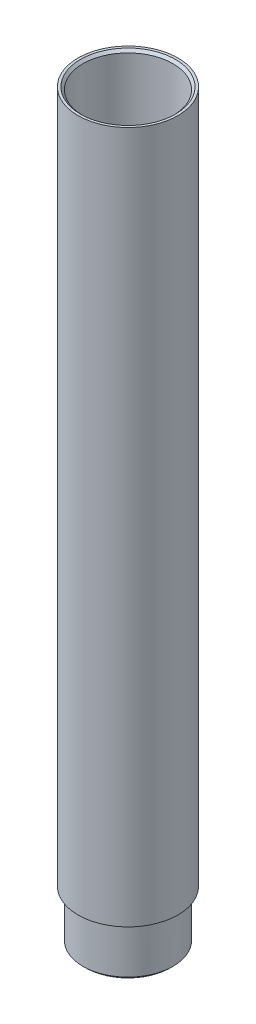
ISO-10303-21;
HEADER;
FILE_DESCRIPTION(('STEP AP214'),'2;1');
FILE_NAME('part.step','',(''),(''),'','','');
FILE_SCHEMA(('AUTOMOTIVE_DESIGN { 1 0 10303 214 1 1 1 1 }'));
ENDSEC;
DATA;
#1=APPLICATION_CONTEXT('core data for automotive mechanical design processes');
#2=APPLICATION_PROTOCOL_DEFINITION('international standard','automotive_design',2000,#1);
#3=PRODUCT_CONTEXT('',#1,'mechanical');
#4=PRODUCT('Part','Part','',(#3));
#5=PRODUCT_RELATED_PRODUCT_CATEGORY('part','',(#4));
#6=PRODUCT_DEFINITION_FORMATION('','',#4);
#7=PRODUCT_DEFINITION_CONTEXT('part definition',#1,'design');
#8=PRODUCT_DEFINITION('design','',#6,#7);
#9=PRODUCT_DEFINITION_SHAPE('','',#8);
#10=(LENGTH_UNIT() NAMED_UNIT(*) SI_UNIT(.MILLI.,.METRE.));
#11=(NAMED_UNIT(*) PLANE_ANGLE_UNIT() SI_UNIT($,.RADIAN.));
#12=(NAMED_UNIT(*) SI_UNIT($,.STERADIAN.) SOLID_ANGLE_UNIT());
#13=UNCERTAINTY_MEASURE_WITH_UNIT(LENGTH_MEASURE(1.E-05),#10,'distance_accuracy_value','');
#14=(GEOMETRIC_REPRESENTATION_CONTEXT(3) GLOBAL_UNCERTAINTY_ASSIGNED_CONTEXT((#13)) GLOBAL_UNIT_ASSIGNED_CONTEXT((#10,
#11,#12)) REPRESENTATION_CONTEXT('',''));
#15=CARTESIAN_POINT('',(0.,0.,0.));
#16=DIRECTION('',(0.,0.,1.));
#17=DIRECTION('',(1.,0.,0.));
#18=AXIS2_PLACEMENT_3D('',#15,#16,#17);
#19=CARTESIAN_POINT('',(0.,280.,0.));
#20=DIRECTION('',(0.,-1.,0.));
#21=DIRECTION('',(0.,0.,-1.));
#22=AXIS2_PLACEMENT_3D('',#19,#20,#21);
#23=CYLINDRICAL_SURFACE('',#22,18.2);
#24=CARTESIAN_POINT('',(0.,279.,0.));
#25=DIRECTION('',(0.,1.,0.));
#26=DIRECTION('',(0.,0.,1.));
#27=AXIS2_PLACEMENT_3D('',#24,#25,#26);
#28=CIRCLE('',#27,18.2);
#29=CARTESIAN_POINT('',(0.,279.,18.2));
#30=VERTEX_POINT('',#29);
#31=EDGE_CURVE('E42',#30,#30,#28,.T.);
#32=ORIENTED_EDGE('',*,*,#31,.T.);
#33=EDGE_LOOP('',(#32));
#34=FACE_BOUND('',#33,.T.);
#35=CARTESIAN_POINT('',(0.,20.,0.));
#36=DIRECTION('',(0.,-1.,0.));
#37=DIRECTION('',(0.,0.,-1.));
#38=AXIS2_PLACEMENT_3D('',#35,#36,#37);
#39=CIRCLE('',#38,18.2);
#40=CARTESIAN_POINT('',(0.,20.,-18.2));
#41=VERTEX_POINT('',#40);
#42=EDGE_CURVE('E64',#41,#41,#39,.T.);
#43=ORIENTED_EDGE('',*,*,#42,.T.);
#44=EDGE_LOOP('',(#43));
#45=FACE_BOUND('',#44,.T.);
#46=ADVANCED_FACE('F34',(#34,#45),#23,.F.);
#47=CARTESIAN_POINT('',(0.,280.,0.));
#48=DIRECTION('',(0.,1.,0.));
#49=DIRECTION('',(0.,0.,1.));
#50=AXIS2_PLACEMENT_3D('',#47,#48,#49);
#51=PLANE('',#50);
#52=CARTESIAN_POINT('',(0.,280.,0.));
#53=DIRECTION('',(0.,1.,0.));
#54=DIRECTION('',(0.,0.,1.));
#55=AXIS2_PLACEMENT_3D('',#52,#53,#54);
#56=CIRCLE('',#55,19.2);
#57=CARTESIAN_POINT('',(0.,280.,19.2));
#58=VERTEX_POINT('',#57);
#59=EDGE_CURVE('E10',#58,#58,#56,.F.);
#60=ORIENTED_EDGE('',*,*,#59,.T.);
#61=EDGE_LOOP('',(#60));
#62=FACE_BOUND('',#61,.T.);
#63=CARTESIAN_POINT('',(0.,280.,0.));
#64=DIRECTION('',(0.,1.,0.));
#65=DIRECTION('',(0.,0.,1.));
#66=AXIS2_PLACEMENT_3D('',#63,#64,#65);
#67=CIRCLE('',#66,20.2);
#68=CARTESIAN_POINT('',(0.,280.,20.2));
#69=VERTEX_POINT('',#68);
#70=EDGE_CURVE('E55',#69,#69,#67,.T.);
#71=ORIENTED_EDGE('',*,*,#70,.T.);
#72=EDGE_LOOP('',(#71));
#73=FACE_BOUND('',#72,.T.);
#74=ADVANCED_FACE('F94',(#62,#73),#51,.T.);
#75=CARTESIAN_POINT('',(0.,0.,0.));
#76=DIRECTION('',(0.,1.,0.));
#77=DIRECTION('',(0.,0.,1.));
#78=AXIS2_PLACEMENT_3D('',#75,#76,#77);
#79=PLANE('',#78);
#80=CARTESIAN_POINT('',(0.,0.,0.));
#81=DIRECTION('',(0.,1.,0.));
#82=DIRECTION('',(0.,0.,1.));
#83=AXIS2_PLACEMENT_3D('',#80,#81,#82);
#84=CIRCLE('',#83,20.2);
#85=CARTESIAN_POINT('',(0.,0.,20.2));
#86=VERTEX_POINT('',#85);
#87=EDGE_CURVE('E56',#86,#86,#84,.T.);
#88=ORIENTED_EDGE('',*,*,#87,.F.);
#89=EDGE_LOOP('',(#88));
#90=FACE_BOUND('',#89,.T.);
#91=CARTESIAN_POINT('',(0.,0.,0.));
#92=DIRECTION('',(0.,1.,0.));
#93=DIRECTION('',(0.,0.,1.));
#94=AXIS2_PLACEMENT_3D('',#91,#92,#93);
#95=CIRCLE('',#94,18.2);
#96=CARTESIAN_POINT('',(0.,0.,18.2));
#97=VERTEX_POINT('',#96);
#98=EDGE_CURVE('E59',#97,#97,#95,.F.);
#99=ORIENTED_EDGE('',*,*,#98,.F.);
#100=EDGE_LOOP('',(#99));
#101=FACE_BOUND('',#100,.T.);
#102=ADVANCED_FACE('F99',(#90,#101),#79,.F.);
#103=CARTESIAN_POINT('',(0.,280.,0.));
#104=DIRECTION('',(0.,-1.,0.));
#105=DIRECTION('',(0.,0.,-1.));
#106=AXIS2_PLACEMENT_3D('',#103,#104,#105);
#107=CYLINDRICAL_SURFACE('',#106,20.2);
#108=ORIENTED_EDGE('',*,*,#70,.F.);
#109=EDGE_LOOP('',(#108));
#110=FACE_BOUND('',#109,.T.);
#111=ORIENTED_EDGE('',*,*,#87,.T.);
#112=EDGE_LOOP('',(#111));
#113=FACE_BOUND('',#112,.T.);
#114=ADVANCED_FACE('F89',(#110,#113),#107,.T.);
#115=CARTESIAN_POINT('',(0.,-20.,0.));
#116=DIRECTION('',(0.,1.,0.));
#117=DIRECTION('',(0.,0.,1.));
#118=AXIS2_PLACEMENT_3D('',#115,#116,#117);
#119=CYLINDRICAL_SURFACE('',#118,18.2);
#120=CARTESIAN_POINT('',(0.,-19.,0.));
#121=DIRECTION('',(0.,-1.,0.));
#122=DIRECTION('',(0.,0.,-1.));
#123=AXIS2_PLACEMENT_3D('',#120,#121,#122);
#124=CIRCLE('',#123,18.2);
#125=CARTESIAN_POINT('',(0.,-19.,-18.2));
#126=VERTEX_POINT('',#125);
#127=EDGE_CURVE('E46',#126,#126,#124,.F.);
#128=ORIENTED_EDGE('',*,*,#127,.T.);
#129=EDGE_LOOP('',(#128));
#130=FACE_BOUND('',#129,.T.);
#131=ORIENTED_EDGE('',*,*,#98,.T.);
#132=EDGE_LOOP('',(#131));
#133=FACE_BOUND('',#132,.T.);
#134=ADVANCED_FACE('F80',(#130,#133),#119,.T.);
#135=CARTESIAN_POINT('',(0.,-20.,0.));
#136=DIRECTION('',(0.,-1.,0.));
#137=DIRECTION('',(0.,0.,-1.));
#138=AXIS2_PLACEMENT_3D('',#135,#136,#137);
#139=PLANE('',#138);
#140=CARTESIAN_POINT('',(0.,-20.,0.));
#141=DIRECTION('',(0.,-1.,0.));
#142=DIRECTION('',(0.,0.,-1.));
#143=AXIS2_PLACEMENT_3D('',#140,#141,#142);
#144=CIRCLE('',#143,17.2);
#145=CARTESIAN_POINT('',(0.,-20.,-17.2));
#146=VERTEX_POINT('',#145);
#147=EDGE_CURVE('E50',#146,#146,#144,.T.);
#148=ORIENTED_EDGE('',*,*,#147,.T.);
#149=EDGE_LOOP('',(#148));
#150=FACE_BOUND('',#149,.T.);
#151=CARTESIAN_POINT('',(0.,-20.,0.));
#152=DIRECTION('',(0.,-1.,0.));
#153=DIRECTION('',(0.,0.,-1.));
#154=AXIS2_PLACEMENT_3D('',#151,#152,#153);
#155=CIRCLE('',#154,16.2);
#156=CARTESIAN_POINT('',(0.,-20.,-16.2));
#157=VERTEX_POINT('',#156);
#158=EDGE_CURVE('E67',#157,#157,#155,.T.);
#159=ORIENTED_EDGE('',*,*,#158,.F.);
#160=EDGE_LOOP('',(#159));
#161=FACE_BOUND('',#160,.T.);
#162=ADVANCED_FACE('F77',(#150,#161),#139,.T.);
#163=CARTESIAN_POINT('',(0.,20.,0.));
#164=DIRECTION('',(0.,-1.,0.));
#165=DIRECTION('',(0.,0.,-1.));
#166=AXIS2_PLACEMENT_3D('',#163,#164,#165);
#167=PLANE('',#166);
#168=ORIENTED_EDGE('',*,*,#42,.F.);
#169=EDGE_LOOP('',(#168));
#170=FACE_BOUND('',#169,.T.);
#171=CARTESIAN_POINT('',(0.,20.,0.));
#172=DIRECTION('',(0.,-1.,0.));
#173=DIRECTION('',(0.,0.,-1.));
#174=AXIS2_PLACEMENT_3D('',#171,#172,#173);
#175=CIRCLE('',#174,16.2);
#176=CARTESIAN_POINT('',(0.,20.,-16.2));
#177=VERTEX_POINT('',#176);
#178=EDGE_CURVE('E68',#177,#177,#175,.T.);
#179=ORIENTED_EDGE('',*,*,#178,.T.);
#180=EDGE_LOOP('',(#179));
#181=FACE_BOUND('',#180,.T.);
#182=ADVANCED_FACE('F79',(#170,#181),#167,.F.);
#183=CARTESIAN_POINT('',(0.,-20.,0.));
#184=DIRECTION('',(0.,1.,0.));
#185=DIRECTION('',(0.,0.,1.));
#186=AXIS2_PLACEMENT_3D('',#183,#184,#185);
#187=CYLINDRICAL_SURFACE('',#186,16.2);
#188=ORIENTED_EDGE('',*,*,#158,.T.);
#189=EDGE_LOOP('',(#188));
#190=FACE_BOUND('',#189,.T.);
#191=ORIENTED_EDGE('',*,*,#178,.F.);
#192=EDGE_LOOP('',(#191));
#193=FACE_BOUND('',#192,.T.);
#194=ADVANCED_FACE('F74',(#190,#193),#187,.F.);
#195=CARTESIAN_POINT('',(0.,-20.,0.));
#196=DIRECTION('',(0.,1.,0.));
#197=DIRECTION('',(0.,0.,1.));
#198=AXIS2_PLACEMENT_3D('',#195,#196,#197);
#199=CONICAL_SURFACE('',#198,17.2,0.785398163397445);
#200=ORIENTED_EDGE('',*,*,#127,.F.);
#201=EDGE_LOOP('',(#200));
#202=FACE_BOUND('',#201,.T.);
#203=ORIENTED_EDGE('',*,*,#147,.F.);
#204=EDGE_LOOP('',(#203));
#205=FACE_BOUND('',#204,.T.);
#206=ADVANCED_FACE('F109',(#202,#205),#199,.T.);
#207=CARTESIAN_POINT('',(0.,279.,0.));
#208=DIRECTION('',(0.,1.,0.));
#209=DIRECTION('',(0.,0.,1.));
#210=AXIS2_PLACEMENT_3D('',#207,#208,#209);
#211=CONICAL_SURFACE('',#210,18.2,0.785398163397445);
#212=ORIENTED_EDGE('',*,*,#59,.F.);
#213=EDGE_LOOP('',(#212));
#214=FACE_BOUND('',#213,.T.);
#215=ORIENTED_EDGE('',*,*,#31,.F.);
#216=EDGE_LOOP('',(#215));
#217=FACE_BOUND('',#216,.T.);
#218=ADVANCED_FACE('F37',(#214,#217),#211,.F.);
#219=CLOSED_SHELL('',(#46,#74,#102,#114,#134,#162,#182,#194,#206,#218));
#220=MANIFOLD_SOLID_BREP('B2',#219);
#221=ADVANCED_BREP_SHAPE_REPRESENTATION('',(#18,#220),#14);
#222=SHAPE_DEFINITION_REPRESENTATION(#9,#221);
ENDSEC;
END-ISO-10303-21;
